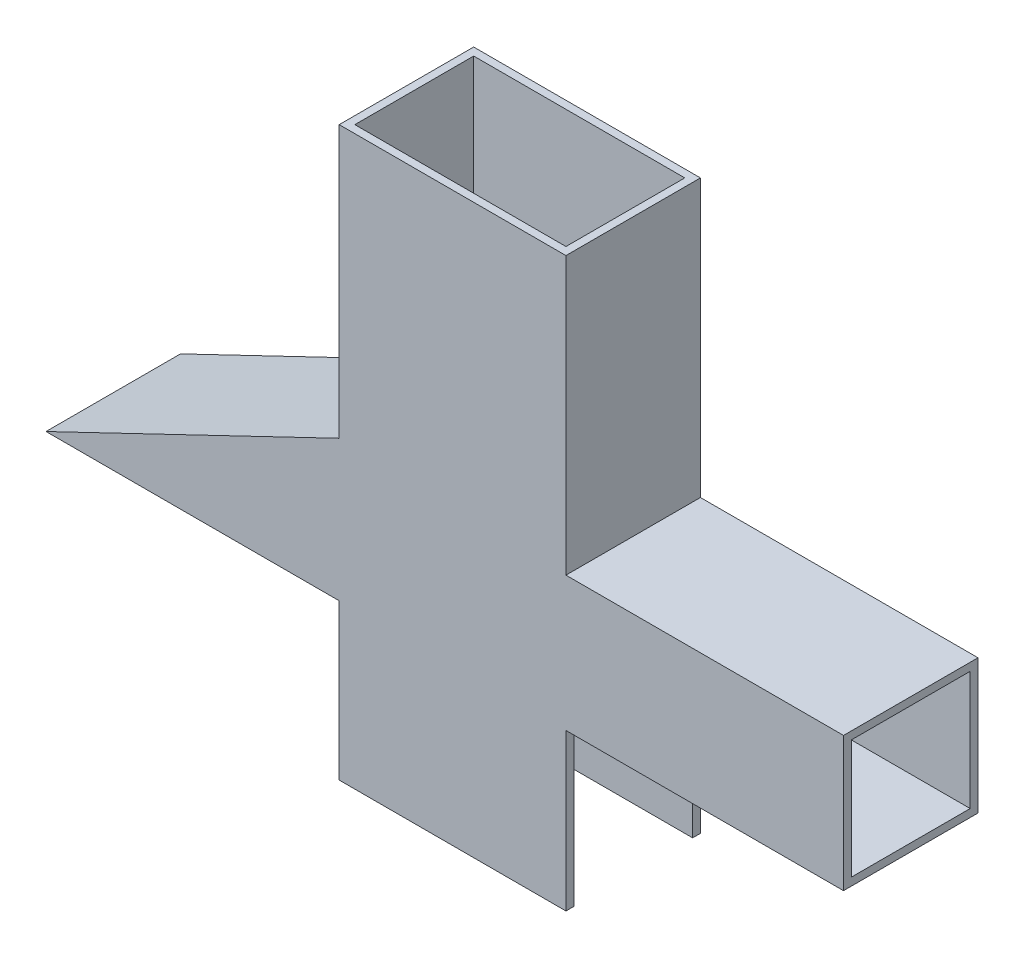
ISO-10303-21;
HEADER;
FILE_DESCRIPTION(('STEP AP214'),'2;1');
FILE_NAME('part.step','',(''),(''),'','','');
FILE_SCHEMA(('AUTOMOTIVE_DESIGN { 1 0 10303 214 1 1 1 1 }'));
ENDSEC;
DATA;
#1=APPLICATION_CONTEXT('core data for automotive mechanical design processes');
#2=APPLICATION_PROTOCOL_DEFINITION('international standard','automotive_design',2000,#1);
#3=PRODUCT_CONTEXT('',#1,'mechanical');
#4=PRODUCT('Part','Part','',(#3));
#5=PRODUCT_RELATED_PRODUCT_CATEGORY('part','',(#4));
#6=PRODUCT_DEFINITION_FORMATION('','',#4);
#7=PRODUCT_DEFINITION_CONTEXT('part definition',#1,'design');
#8=PRODUCT_DEFINITION('design','',#6,#7);
#9=PRODUCT_DEFINITION_SHAPE('','',#8);
#10=(LENGTH_UNIT() NAMED_UNIT(*) SI_UNIT(.MILLI.,.METRE.));
#11=(NAMED_UNIT(*) PLANE_ANGLE_UNIT() SI_UNIT($,.RADIAN.));
#12=(NAMED_UNIT(*) SI_UNIT($,.STERADIAN.) SOLID_ANGLE_UNIT());
#13=UNCERTAINTY_MEASURE_WITH_UNIT(LENGTH_MEASURE(1.E-05),#10,'distance_accuracy_value','');
#14=(GEOMETRIC_REPRESENTATION_CONTEXT(3) GLOBAL_UNCERTAINTY_ASSIGNED_CONTEXT((#13)) GLOBAL_UNIT_ASSIGNED_CONTEXT((#10,
#11,#12)) REPRESENTATION_CONTEXT('',''));
#15=CARTESIAN_POINT('',(0.,0.,0.));
#16=DIRECTION('',(0.,0.,1.));
#17=DIRECTION('',(1.,0.,0.));
#18=AXIS2_PLACEMENT_3D('',#15,#16,#17);
#19=CARTESIAN_POINT('',(-32.7009945375093,258.,-10.9512412704194));
#20=DIRECTION('',(1.,0.,0.));
#21=DIRECTION('',(0.,0.,-1.));
#22=AXIS2_PLACEMENT_3D('',#19,#20,#21);
#23=PLANE('',#22);
#24=DIRECTION('',(0.,0.,1.));
#25=VECTOR('',#24,1.);
#26=CARTESIAN_POINT('',(-32.7009945375092,-105.,70.0487587295806));
#27=LINE('',#26,#25);
#28=CARTESIAN_POINT('',(-32.7009945375092,-105.,-10.9512412704194));
#29=VERTEX_POINT('',#28);
#30=CARTESIAN_POINT('',(-32.7009945375092,-105.,65.0487587295806));
#31=VERTEX_POINT('',#30);
#32=EDGE_CURVE('E192',#29,#31,#27,.T.);
#33=ORIENTED_EDGE('',*,*,#32,.F.);
#34=DIRECTION('',(0.,-1.,0.));
#35=VECTOR('',#34,1.);
#36=CARTESIAN_POINT('',(-32.7009945375093,258.,-10.9512412704194));
#37=LINE('',#36,#35);
#38=CARTESIAN_POINT('',(-32.7009945375093,258.,-10.9512412704194));
#39=VERTEX_POINT('',#38);
#40=EDGE_CURVE('E51',#39,#29,#37,.T.);
#41=ORIENTED_EDGE('',*,*,#40,.F.);
#42=DIRECTION('',(0.,0.,1.));
#43=VECTOR('',#42,1.);
#44=CARTESIAN_POINT('',(-32.7009945375093,258.,-10.9512412704194));
#45=LINE('',#44,#43);
#46=CARTESIAN_POINT('',(-32.7009945375092,258.,65.0487587295806));
#47=VERTEX_POINT('',#46);
#48=EDGE_CURVE('E334',#39,#47,#45,.T.);
#49=ORIENTED_EDGE('',*,*,#48,.T.);
#50=DIRECTION('',(0.,-1.,0.));
#51=VECTOR('',#50,1.);
#52=CARTESIAN_POINT('',(-32.7009945375092,258.,65.0487587295806));
#53=LINE('',#52,#51);
#54=EDGE_CURVE('E322',#47,#31,#53,.T.);
#55=ORIENTED_EDGE('',*,*,#54,.T.);
#56=EDGE_LOOP('',(#33,#41,#49,#55));
#57=FACE_BOUND('',#56,.T.);
#58=ADVANCED_FACE('F33',(#57),#23,.T.);
#59=CARTESIAN_POINT('',(0.,-5.,0.));
#60=DIRECTION('',(0.,-1.,0.));
#61=DIRECTION('',(0.,0.,-1.));
#62=AXIS2_PLACEMENT_3D('',#59,#60,#61);
#63=PLANE('',#62);
#64=DIRECTION('',(-1.,0.,0.));
#65=VECTOR('',#64,1.);
#66=CARTESIAN_POINT('',(-32.7009945375092,-5.,-10.9512412704194));
#67=LINE('',#66,#65);
#68=CARTESIAN_POINT('',(107.299005462491,-5.,-10.9512412704194));
#69=VERTEX_POINT('',#68);
#70=CARTESIAN_POINT('',(-2.70099453750923,-5.,-10.9512412704194));
#71=VERTEX_POINT('',#70);
#72=EDGE_CURVE('E206',#69,#71,#67,.T.);
#73=ORIENTED_EDGE('',*,*,#72,.F.);
#74=DIRECTION('',(0.,0.,1.));
#75=VECTOR('',#74,1.);
#76=CARTESIAN_POINT('',(107.299005462491,-5.,-10.9512412704194));
#77=LINE('',#76,#75);
#78=CARTESIAN_POINT('',(107.299005462491,-5.,-15.9512412704194));
#79=VERTEX_POINT('',#78);
#80=EDGE_CURVE('E209',#79,#69,#77,.T.);
#81=ORIENTED_EDGE('',*,*,#80,.F.);
#82=DIRECTION('',(1.,0.,0.));
#83=VECTOR('',#82,1.);
#84=CARTESIAN_POINT('',(-37.7009945375092,-5.,-15.9512412704194));
#85=LINE('',#84,#83);
#86=CARTESIAN_POINT('',(284.799005462491,-5.,-15.9512412704194));
#87=VERTEX_POINT('',#86);
#88=EDGE_CURVE('E37',#79,#87,#85,.T.);
#89=ORIENTED_EDGE('',*,*,#88,.T.);
#90=DIRECTION('',(0.,0.,-1.));
#91=VECTOR('',#90,1.);
#92=CARTESIAN_POINT('',(284.799005462491,-5.,70.0487587295806));
#93=LINE('',#92,#91);
#94=CARTESIAN_POINT('',(284.799005462491,-5.,70.0487587295806));
#95=VERTEX_POINT('',#94);
#96=EDGE_CURVE('E249',#95,#87,#93,.T.);
#97=ORIENTED_EDGE('',*,*,#96,.F.);
#98=DIRECTION('',(-1.,0.,0.));
#99=VECTOR('',#98,1.);
#100=CARTESIAN_POINT('',(-37.7009945375092,-5.,70.0487587295806));
#101=LINE('',#100,#99);
#102=CARTESIAN_POINT('',(107.299005462491,-5.,70.0487587295806));
#103=VERTEX_POINT('',#102);
#104=EDGE_CURVE('E355',#95,#103,#101,.T.);
#105=ORIENTED_EDGE('',*,*,#104,.T.);
#106=DIRECTION('',(0.,0.,1.));
#107=VECTOR('',#106,1.);
#108=CARTESIAN_POINT('',(107.299005462491,-5.,70.0487587295806));
#109=LINE('',#108,#107);
#110=CARTESIAN_POINT('',(107.299005462491,-5.,65.0487587295806));
#111=VERTEX_POINT('',#110);
#112=EDGE_CURVE('E217',#111,#103,#109,.T.);
#113=ORIENTED_EDGE('',*,*,#112,.F.);
#114=DIRECTION('',(1.,0.,0.));
#115=VECTOR('',#114,1.);
#116=CARTESIAN_POINT('',(-32.7009945375092,-5.,65.0487587295806));
#117=LINE('',#116,#115);
#118=CARTESIAN_POINT('',(-2.70099453750924,-5.,65.0487587295806));
#119=VERTEX_POINT('',#118);
#120=EDGE_CURVE('E200',#119,#111,#117,.T.);
#121=ORIENTED_EDGE('',*,*,#120,.F.);
#122=DIRECTION('',(0.,0.,1.));
#123=VECTOR('',#122,1.);
#124=CARTESIAN_POINT('',(-2.70099453750924,-5.,65.0487587295806));
#125=LINE('',#124,#123);
#126=EDGE_CURVE('E340',#71,#119,#125,.T.);
#127=ORIENTED_EDGE('',*,*,#126,.F.);
#128=EDGE_LOOP('',(#73,#81,#89,#97,#105,#113,#121,#127));
#129=FACE_BOUND('',#128,.T.);
#130=ADVANCED_FACE('F408',(#129),#63,.T.);
#131=CARTESIAN_POINT('',(107.299005462491,258.,-15.9512412704194));
#132=DIRECTION('',(-1.,0.,0.));
#133=DIRECTION('',(0.,0.,1.));
#134=AXIS2_PLACEMENT_3D('',#131,#132,#133);
#135=PLANE('',#134);
#136=DIRECTION('',(0.,0.,1.));
#137=VECTOR('',#136,1.);
#138=CARTESIAN_POINT('',(107.299005462491,81.,70.0487587295806));
#139=LINE('',#138,#137);
#140=CARTESIAN_POINT('',(107.299005462491,81.,-15.9512412704194));
#141=VERTEX_POINT('',#140);
#142=CARTESIAN_POINT('',(107.299005462491,81.,70.0487587295806));
#143=VERTEX_POINT('',#142);
#144=EDGE_CURVE('E59',#141,#143,#139,.T.);
#145=ORIENTED_EDGE('',*,*,#144,.F.);
#146=DIRECTION('',(0.,-1.,0.));
#147=VECTOR('',#146,1.);
#148=CARTESIAN_POINT('',(107.299005462491,258.,-15.9512412704194));
#149=LINE('',#148,#147);
#150=CARTESIAN_POINT('',(107.299005462491,258.,-15.9512412704194));
#151=VERTEX_POINT('',#150);
#152=EDGE_CURVE('E264',#151,#141,#149,.T.);
#153=ORIENTED_EDGE('',*,*,#152,.F.);
#154=DIRECTION('',(0.,0.,-1.));
#155=VECTOR('',#154,1.);
#156=CARTESIAN_POINT('',(107.299005462491,258.,-15.9512412704194));
#157=LINE('',#156,#155);
#158=CARTESIAN_POINT('',(107.299005462491,258.,70.0487587295806));
#159=VERTEX_POINT('',#158);
#160=EDGE_CURVE('E315',#159,#151,#157,.T.);
#161=ORIENTED_EDGE('',*,*,#160,.F.);
#162=DIRECTION('',(0.,-1.,0.));
#163=VECTOR('',#162,1.);
#164=CARTESIAN_POINT('',(107.299005462491,258.,70.0487587295806));
#165=LINE('',#164,#163);
#166=EDGE_CURVE('E292',#159,#143,#165,.T.);
#167=ORIENTED_EDGE('',*,*,#166,.T.);
#168=EDGE_LOOP('',(#145,#153,#161,#167));
#169=FACE_BOUND('',#168,.T.);
#170=ADVANCED_FACE('F449',(#169),#135,.F.);
#171=CARTESIAN_POINT('',(-37.7009945375092,258.,-15.9512412704194));
#172=DIRECTION('',(1.,0.,0.));
#173=DIRECTION('',(0.,0.,-1.));
#174=AXIS2_PLACEMENT_3D('',#171,#172,#173);
#175=PLANE('',#174);
#176=DIRECTION('',(0.,0.,1.));
#177=VECTOR('',#176,1.);
#178=CARTESIAN_POINT('',(-37.7009945375092,-5.7005147682519,-15.9512412704194));
#179=LINE('',#178,#177);
#180=CARTESIAN_POINT('',(-37.7009945375092,-5.7005147682519,-15.9512412704194));
#181=VERTEX_POINT('',#180);
#182=CARTESIAN_POINT('',(-37.7009945375092,-5.7005147682519,70.0487587295806));
#183=VERTEX_POINT('',#182);
#184=EDGE_CURVE('E422',#181,#183,#179,.T.);
#185=ORIENTED_EDGE('',*,*,#184,.F.);
#186=DIRECTION('',(0.,-1.,0.));
#187=VECTOR('',#186,1.);
#188=CARTESIAN_POINT('',(-37.7009945375092,258.,-15.9512412704194));
#189=LINE('',#188,#187);
#190=CARTESIAN_POINT('',(-37.7009945375092,-105.,-15.9512412704194));
#191=VERTEX_POINT('',#190);
#192=EDGE_CURVE('E306',#181,#191,#189,.T.);
#193=ORIENTED_EDGE('',*,*,#192,.T.);
#194=DIRECTION('',(0.,0.,-1.));
#195=VECTOR('',#194,1.);
#196=CARTESIAN_POINT('',(-37.7009945375092,-105.,70.0487587295806));
#197=LINE('',#196,#195);
#198=CARTESIAN_POINT('',(-37.7009945375092,-105.,70.0487587295806));
#199=VERTEX_POINT('',#198);
#200=EDGE_CURVE('E189',#199,#191,#197,.T.);
#201=ORIENTED_EDGE('',*,*,#200,.F.);
#202=DIRECTION('',(0.,-1.,0.));
#203=VECTOR('',#202,1.);
#204=CARTESIAN_POINT('',(-37.7009945375092,258.,70.0487587295806));
#205=LINE('',#204,#203);
#206=EDGE_CURVE('E43',#183,#199,#205,.T.);
#207=ORIENTED_EDGE('',*,*,#206,.F.);
#208=EDGE_LOOP('',(#185,#193,#201,#207));
#209=FACE_BOUND('',#208,.T.);
#210=ADVANCED_FACE('F476',(#209),#175,.F.);
#211=CARTESIAN_POINT('',(0.,258.,0.));
#212=DIRECTION('',(0.,1.,0.));
#213=DIRECTION('',(0.,0.,1.));
#214=AXIS2_PLACEMENT_3D('',#211,#212,#213);
#215=PLANE('',#214);
#216=DIRECTION('',(0.,0.,1.));
#217=VECTOR('',#216,1.);
#218=CARTESIAN_POINT('',(-37.7009945375092,258.,-15.9512412704194));
#219=LINE('',#218,#217);
#220=CARTESIAN_POINT('',(-37.7009945375092,258.,-15.9512412704194));
#221=VERTEX_POINT('',#220);
#222=CARTESIAN_POINT('',(-37.7009945375092,258.,70.0487587295806));
#223=VERTEX_POINT('',#222);
#224=EDGE_CURVE('E319',#221,#223,#219,.T.);
#225=ORIENTED_EDGE('',*,*,#224,.T.);
#226=DIRECTION('',(1.,0.,0.));
#227=VECTOR('',#226,1.);
#228=CARTESIAN_POINT('',(-37.7009945375092,258.,70.0487587295806));
#229=LINE('',#228,#227);
#230=EDGE_CURVE('E317',#223,#159,#229,.T.);
#231=ORIENTED_EDGE('',*,*,#230,.T.);
#232=ORIENTED_EDGE('',*,*,#160,.T.);
#233=DIRECTION('',(-1.,0.,0.));
#234=VECTOR('',#233,1.);
#235=CARTESIAN_POINT('',(-37.7009945375092,258.,-15.9512412704194));
#236=LINE('',#235,#234);
#237=EDGE_CURVE('E309',#151,#221,#236,.T.);
#238=ORIENTED_EDGE('',*,*,#237,.T.);
#239=EDGE_LOOP('',(#225,#231,#232,#238));
#240=FACE_BOUND('',#239,.T.);
#241=DIRECTION('',(1.,0.,0.));
#242=VECTOR('',#241,1.);
#243=CARTESIAN_POINT('',(-32.7009945375092,258.,65.0487587295806));
#244=LINE('',#243,#242);
#245=CARTESIAN_POINT('',(102.299005462491,258.,65.0487587295806));
#246=VERTEX_POINT('',#245);
#247=EDGE_CURVE('E370',#47,#246,#244,.T.);
#248=ORIENTED_EDGE('',*,*,#247,.F.);
#249=ORIENTED_EDGE('',*,*,#48,.F.);
#250=DIRECTION('',(-1.,0.,0.));
#251=VECTOR('',#250,1.);
#252=CARTESIAN_POINT('',(-32.7009945375093,258.,-10.9512412704194));
#253=LINE('',#252,#251);
#254=CARTESIAN_POINT('',(102.299005462491,258.,-10.9512412704194));
#255=VERTEX_POINT('',#254);
#256=EDGE_CURVE('E365',#255,#39,#253,.T.);
#257=ORIENTED_EDGE('',*,*,#256,.F.);
#258=DIRECTION('',(0.,0.,-1.));
#259=VECTOR('',#258,1.);
#260=CARTESIAN_POINT('',(102.299005462491,258.,-10.9512412704194));
#261=LINE('',#260,#259);
#262=EDGE_CURVE('E367',#246,#255,#261,.T.);
#263=ORIENTED_EDGE('',*,*,#262,.F.);
#264=EDGE_LOOP('',(#248,#249,#257,#263));
#265=FACE_BOUND('',#264,.T.);
#266=ADVANCED_FACE('F384',(#240,#265),#215,.T.);
#267=CARTESIAN_POINT('',(-37.7009945375093,84.2994852317481,-15.9512412704194));
#268=VERTEX_POINT('',#267);
#269=EDGE_CURVE('E308',#221,#268,#189,.T.);
#270=ORIENTED_EDGE('',*,*,#269,.T.);
#271=DIRECTION('',(0.,0.,1.));
#272=VECTOR('',#271,1.);
#273=CARTESIAN_POINT('',(-37.7009945375093,84.2994852317481,-15.9512412704194));
#274=LINE('',#273,#272);
#275=CARTESIAN_POINT('',(-37.7009945375092,84.2994852317481,70.0487587295806));
#276=VERTEX_POINT('',#275);
#277=EDGE_CURVE('E424',#268,#276,#274,.T.);
#278=ORIENTED_EDGE('',*,*,#277,.T.);
#279=EDGE_CURVE('E11',#223,#276,#205,.T.);
#280=ORIENTED_EDGE('',*,*,#279,.F.);
#281=ORIENTED_EDGE('',*,*,#224,.F.);
#282=EDGE_LOOP('',(#270,#278,#280,#281));
#283=FACE_BOUND('',#282,.T.);
#284=ADVANCED_FACE('F35',(#283),#175,.F.);
#285=CARTESIAN_POINT('',(-37.7009945375092,258.,70.0487587295806));
#286=DIRECTION('',(0.,0.,-1.));
#287=DIRECTION('',(-1.,0.,0.));
#288=AXIS2_PLACEMENT_3D('',#285,#286,#287);
#289=PLANE('',#288);
#290=ORIENTED_EDGE('',*,*,#279,.T.);
#291=DIRECTION('',(-0.901523057468274,-0.432731067584771,0.));
#292=VECTOR('',#291,1.);
#293=CARTESIAN_POINT('',(-37.7009945375093,84.2994852317481,70.0487587295806));
#294=LINE('',#293,#292);
#295=CARTESIAN_POINT('',(-225.200994537509,-5.7005147682519,70.0487587295806));
#296=VERTEX_POINT('',#295);
#297=EDGE_CURVE('E279',#276,#296,#294,.T.);
#298=ORIENTED_EDGE('',*,*,#297,.T.);
#299=DIRECTION('',(1.,0.,0.));
#300=VECTOR('',#299,1.);
#301=CARTESIAN_POINT('',(-225.200994537509,-5.7005147682519,70.0487587295806));
#302=LINE('',#301,#300);
#303=EDGE_CURVE('E273',#296,#183,#302,.T.);
#304=ORIENTED_EDGE('',*,*,#303,.T.);
#305=ORIENTED_EDGE('',*,*,#206,.T.);
#306=DIRECTION('',(-1.,0.,0.));
#307=VECTOR('',#306,1.);
#308=CARTESIAN_POINT('',(-37.7009945375092,-105.,70.0487587295806));
#309=LINE('',#308,#307);
#310=CARTESIAN_POINT('',(107.299005462491,-105.,70.0487587295806));
#311=VERTEX_POINT('',#310);
#312=EDGE_CURVE('E346',#311,#199,#309,.T.);
#313=ORIENTED_EDGE('',*,*,#312,.F.);
#314=DIRECTION('',(0.,1.,0.));
#315=VECTOR('',#314,1.);
#316=CARTESIAN_POINT('',(107.299005462491,-105.,70.0487587295806));
#317=LINE('',#316,#315);
#318=EDGE_CURVE('E220',#311,#103,#317,.T.);
#319=ORIENTED_EDGE('',*,*,#318,.T.);
#320=ORIENTED_EDGE('',*,*,#104,.F.);
#321=DIRECTION('',(0.,-1.,0.));
#322=VECTOR('',#321,1.);
#323=CARTESIAN_POINT('',(284.799005462491,81.,70.0487587295806));
#324=LINE('',#323,#322);
#325=CARTESIAN_POINT('',(284.799005462491,81.,70.0487587295806));
#326=VERTEX_POINT('',#325);
#327=EDGE_CURVE('E246',#326,#95,#324,.T.);
#328=ORIENTED_EDGE('',*,*,#327,.F.);
#329=DIRECTION('',(-1.,0.,0.));
#330=VECTOR('',#329,1.);
#331=CARTESIAN_POINT('',(284.799005462491,81.,70.0487587295806));
#332=LINE('',#331,#330);
#333=EDGE_CURVE('E256',#326,#143,#332,.T.);
#334=ORIENTED_EDGE('',*,*,#333,.T.);
#335=ORIENTED_EDGE('',*,*,#166,.F.);
#336=ORIENTED_EDGE('',*,*,#230,.F.);
#337=EDGE_LOOP('',(#290,#298,#304,#305,#313,#319,#320,#328,#334,#335,#336));
#338=FACE_BOUND('',#337,.T.);
#339=ADVANCED_FACE('F415',(#338),#289,.F.);
#340=CARTESIAN_POINT('',(-37.7009945375092,258.,-15.9512412704194));
#341=DIRECTION('',(0.,0.,1.));
#342=DIRECTION('',(1.,0.,0.));
#343=AXIS2_PLACEMENT_3D('',#340,#341,#342);
#344=PLANE('',#343);
#345=ORIENTED_EDGE('',*,*,#152,.T.);
#346=DIRECTION('',(-1.,0.,0.));
#347=VECTOR('',#346,1.);
#348=CARTESIAN_POINT('',(284.799005462491,81.,-15.9512412704194));
#349=LINE('',#348,#347);
#350=CARTESIAN_POINT('',(284.799005462491,81.,-15.9512412704194));
#351=VERTEX_POINT('',#350);
#352=EDGE_CURVE('E269',#351,#141,#349,.T.);
#353=ORIENTED_EDGE('',*,*,#352,.F.);
#354=DIRECTION('',(0.,1.,0.));
#355=VECTOR('',#354,1.);
#356=CARTESIAN_POINT('',(284.799005462491,81.,-15.9512412704194));
#357=LINE('',#356,#355);
#358=EDGE_CURVE('E252',#87,#351,#357,.T.);
#359=ORIENTED_EDGE('',*,*,#358,.F.);
#360=ORIENTED_EDGE('',*,*,#88,.F.);
#361=DIRECTION('',(0.,1.,0.));
#362=VECTOR('',#361,1.);
#363=CARTESIAN_POINT('',(107.299005462491,-105.,-15.9512412704194));
#364=LINE('',#363,#362);
#365=CARTESIAN_POINT('',(107.299005462491,-105.,-15.9512412704194));
#366=VERTEX_POINT('',#365);
#367=EDGE_CURVE('E195',#366,#79,#364,.T.);
#368=ORIENTED_EDGE('',*,*,#367,.F.);
#369=DIRECTION('',(1.,0.,0.));
#370=VECTOR('',#369,1.);
#371=CARTESIAN_POINT('',(-37.7009945375092,-105.,-15.9512412704194));
#372=LINE('',#371,#370);
#373=EDGE_CURVE('E181',#191,#366,#372,.T.);
#374=ORIENTED_EDGE('',*,*,#373,.F.);
#375=ORIENTED_EDGE('',*,*,#192,.F.);
#376=DIRECTION('',(1.,0.,0.));
#377=VECTOR('',#376,1.);
#378=CARTESIAN_POINT('',(-225.200994537509,-5.7005147682519,-15.9512412704194));
#379=LINE('',#378,#377);
#380=CARTESIAN_POINT('',(-225.200994537509,-5.7005147682519,-15.9512412704194));
#381=VERTEX_POINT('',#380);
#382=EDGE_CURVE('E285',#381,#181,#379,.T.);
#383=ORIENTED_EDGE('',*,*,#382,.F.);
#384=DIRECTION('',(-0.901523057468274,-0.432731067584771,0.));
#385=VECTOR('',#384,1.);
#386=CARTESIAN_POINT('',(-37.7009945375093,84.2994852317481,-15.9512412704194));
#387=LINE('',#386,#385);
#388=EDGE_CURVE('E425',#268,#381,#387,.T.);
#389=ORIENTED_EDGE('',*,*,#388,.F.);
#390=ORIENTED_EDGE('',*,*,#269,.F.);
#391=ORIENTED_EDGE('',*,*,#237,.F.);
#392=EDGE_LOOP('',(#345,#353,#359,#360,#368,#374,#375,#383,#389,#390,#391));
#393=FACE_BOUND('',#392,.T.);
#394=ADVANCED_FACE('F196',(#393),#344,.F.);
#395=CARTESIAN_POINT('',(-32.7009945375092,258.,65.0487587295806));
#396=DIRECTION('',(0.,0.,-1.));
#397=DIRECTION('',(-1.,0.,0.));
#398=AXIS2_PLACEMENT_3D('',#395,#396,#397);
#399=PLANE('',#398);
#400=DIRECTION('',(0.,-1.,0.));
#401=VECTOR('',#400,1.);
#402=CARTESIAN_POINT('',(102.299005462491,258.,65.0487587295806));
#403=LINE('',#402,#401);
#404=CARTESIAN_POINT('',(102.299005462491,76.,65.0487587295806));
#405=VERTEX_POINT('',#404);
#406=EDGE_CURVE('E323',#246,#405,#403,.T.);
#407=ORIENTED_EDGE('',*,*,#406,.T.);
#408=DIRECTION('',(-1.,0.,0.));
#409=VECTOR('',#408,1.);
#410=CARTESIAN_POINT('',(284.799005462491,76.,65.0487587295806));
#411=LINE('',#410,#409);
#412=CARTESIAN_POINT('',(284.799005462491,76.,65.0487587295806));
#413=VERTEX_POINT('',#412);
#414=EDGE_CURVE('E242',#413,#405,#411,.T.);
#415=ORIENTED_EDGE('',*,*,#414,.F.);
#416=DIRECTION('',(0.,-1.,0.));
#417=VECTOR('',#416,1.);
#418=CARTESIAN_POINT('',(284.799005462491,76.,65.0487587295806));
#419=LINE('',#418,#417);
#420=CARTESIAN_POINT('',(284.799005462491,0.,65.0487587295806));
#421=VERTEX_POINT('',#420);
#422=EDGE_CURVE('E231',#413,#421,#419,.T.);
#423=ORIENTED_EDGE('',*,*,#422,.T.);
#424=DIRECTION('',(1.,0.,0.));
#425=VECTOR('',#424,1.);
#426=CARTESIAN_POINT('',(-32.7009945375092,0.,65.0487587295806));
#427=LINE('',#426,#425);
#428=CARTESIAN_POINT('',(-2.70099453750924,0.,65.0487587295806));
#429=VERTEX_POINT('',#428);
#430=EDGE_CURVE('E300',#429,#421,#427,.T.);
#431=ORIENTED_EDGE('',*,*,#430,.F.);
#432=DIRECTION('',(0.,-1.,0.));
#433=VECTOR('',#432,1.);
#434=CARTESIAN_POINT('',(-2.70099453750924,0.,65.0487587295806));
#435=LINE('',#434,#433);
#436=EDGE_CURVE('E341',#429,#119,#435,.T.);
#437=ORIENTED_EDGE('',*,*,#436,.T.);
#438=ORIENTED_EDGE('',*,*,#120,.T.);
#439=DIRECTION('',(0.,1.,0.));
#440=VECTOR('',#439,1.);
#441=CARTESIAN_POINT('',(107.299005462491,-105.,65.0487587295806));
#442=LINE('',#441,#440);
#443=CARTESIAN_POINT('',(107.299005462491,-105.,65.0487587295806));
#444=VERTEX_POINT('',#443);
#445=EDGE_CURVE('E225',#444,#111,#442,.T.);
#446=ORIENTED_EDGE('',*,*,#445,.F.);
#447=DIRECTION('',(1.,0.,0.));
#448=VECTOR('',#447,1.);
#449=CARTESIAN_POINT('',(-32.7009945375092,-105.,65.0487587295806));
#450=LINE('',#449,#448);
#451=EDGE_CURVE('E214',#31,#444,#450,.T.);
#452=ORIENTED_EDGE('',*,*,#451,.F.);
#453=ORIENTED_EDGE('',*,*,#54,.F.);
#454=ORIENTED_EDGE('',*,*,#247,.T.);
#455=EDGE_LOOP('',(#407,#415,#423,#431,#437,#438,#446,#452,#453,#454));
#456=FACE_BOUND('',#455,.T.);
#457=ADVANCED_FACE('F381',(#456),#399,.T.);
#458=CARTESIAN_POINT('',(102.299005462491,258.,-10.9512412704194));
#459=DIRECTION('',(-1.,0.,0.));
#460=DIRECTION('',(0.,0.,1.));
#461=AXIS2_PLACEMENT_3D('',#458,#459,#460);
#462=PLANE('',#461);
#463=DIRECTION('',(0.,0.,-1.));
#464=VECTOR('',#463,1.);
#465=CARTESIAN_POINT('',(102.299005462491,76.,-10.9512412704194));
#466=LINE('',#465,#464);
#467=CARTESIAN_POINT('',(102.299005462491,76.,-10.9512412704193));
#468=VERTEX_POINT('',#467);
#469=EDGE_CURVE('E228',#405,#468,#466,.T.);
#470=ORIENTED_EDGE('',*,*,#469,.F.);
#471=ORIENTED_EDGE('',*,*,#406,.F.);
#472=ORIENTED_EDGE('',*,*,#262,.T.);
#473=DIRECTION('',(0.,-1.,0.));
#474=VECTOR('',#473,1.);
#475=CARTESIAN_POINT('',(102.299005462491,258.,-10.9512412704194));
#476=LINE('',#475,#474);
#477=EDGE_CURVE('E326',#255,#468,#476,.T.);
#478=ORIENTED_EDGE('',*,*,#477,.T.);
#479=EDGE_LOOP('',(#470,#471,#472,#478));
#480=FACE_BOUND('',#479,.T.);
#481=ADVANCED_FACE('F387',(#480),#462,.T.);
#482=CARTESIAN_POINT('',(-32.7009945375093,258.,-10.9512412704194));
#483=DIRECTION('',(0.,0.,1.));
#484=DIRECTION('',(1.,0.,0.));
#485=AXIS2_PLACEMENT_3D('',#482,#483,#484);
#486=PLANE('',#485);
#487=DIRECTION('',(-1.,0.,0.));
#488=VECTOR('',#487,1.);
#489=CARTESIAN_POINT('',(-32.7009945375093,0.,-10.9512412704194));
#490=LINE('',#489,#488);
#491=CARTESIAN_POINT('',(284.799005462491,0.,-10.9512412704194));
#492=VERTEX_POINT('',#491);
#493=CARTESIAN_POINT('',(-2.70099453750923,0.,-10.9512412704194));
#494=VERTEX_POINT('',#493);
#495=EDGE_CURVE('E332',#492,#494,#490,.T.);
#496=ORIENTED_EDGE('',*,*,#495,.F.);
#497=DIRECTION('',(0.,1.,0.));
#498=VECTOR('',#497,1.);
#499=CARTESIAN_POINT('',(284.799005462491,76.,-10.9512412704194));
#500=LINE('',#499,#498);
#501=CARTESIAN_POINT('',(284.799005462491,76.,-10.9512412704194));
#502=VERTEX_POINT('',#501);
#503=EDGE_CURVE('E237',#492,#502,#500,.T.);
#504=ORIENTED_EDGE('',*,*,#503,.T.);
#505=DIRECTION('',(-1.,0.,0.));
#506=VECTOR('',#505,1.);
#507=CARTESIAN_POINT('',(284.799005462491,76.,-10.9512412704194));
#508=LINE('',#507,#506);
#509=EDGE_CURVE('E244',#502,#468,#508,.T.);
#510=ORIENTED_EDGE('',*,*,#509,.T.);
#511=ORIENTED_EDGE('',*,*,#477,.F.);
#512=ORIENTED_EDGE('',*,*,#256,.T.);
#513=ORIENTED_EDGE('',*,*,#40,.T.);
#514=DIRECTION('',(-1.,0.,0.));
#515=VECTOR('',#514,1.);
#516=CARTESIAN_POINT('',(-32.7009945375092,-105.,-10.9512412704194));
#517=LINE('',#516,#515);
#518=CARTESIAN_POINT('',(107.299005462491,-105.,-10.9512412704194));
#519=VERTEX_POINT('',#518);
#520=EDGE_CURVE('E205',#519,#29,#517,.T.);
#521=ORIENTED_EDGE('',*,*,#520,.F.);
#522=DIRECTION('',(0.,1.,0.));
#523=VECTOR('',#522,1.);
#524=CARTESIAN_POINT('',(107.299005462491,-105.,-10.9512412704194));
#525=LINE('',#524,#523);
#526=EDGE_CURVE('E201',#519,#69,#525,.T.);
#527=ORIENTED_EDGE('',*,*,#526,.T.);
#528=ORIENTED_EDGE('',*,*,#72,.T.);
#529=DIRECTION('',(0.,-1.,0.));
#530=VECTOR('',#529,1.);
#531=CARTESIAN_POINT('',(-2.70099453750923,0.,-10.9512412704194));
#532=LINE('',#531,#530);
#533=EDGE_CURVE('E339',#494,#71,#532,.T.);
#534=ORIENTED_EDGE('',*,*,#533,.F.);
#535=EDGE_LOOP('',(#496,#504,#510,#511,#512,#513,#521,#527,#528,#534));
#536=FACE_BOUND('',#535,.T.);
#537=ADVANCED_FACE('F453',(#536),#486,.T.);
#538=CARTESIAN_POINT('',(0.,0.,0.));
#539=DIRECTION('',(0.,-1.,0.));
#540=DIRECTION('',(0.,0.,-1.));
#541=AXIS2_PLACEMENT_3D('',#538,#539,#540);
#542=PLANE('',#541);
#543=ORIENTED_EDGE('',*,*,#495,.T.);
#544=DIRECTION('',(0.,0.,1.));
#545=VECTOR('',#544,1.);
#546=CARTESIAN_POINT('',(-2.70099453750924,0.,65.0487587295806));
#547=LINE('',#546,#545);
#548=EDGE_CURVE('E335',#494,#429,#547,.T.);
#549=ORIENTED_EDGE('',*,*,#548,.T.);
#550=ORIENTED_EDGE('',*,*,#430,.T.);
#551=DIRECTION('',(0.,0.,-1.));
#552=VECTOR('',#551,1.);
#553=CARTESIAN_POINT('',(284.799005462491,0.,65.0487587295806));
#554=LINE('',#553,#552);
#555=EDGE_CURVE('E234',#421,#492,#554,.T.);
#556=ORIENTED_EDGE('',*,*,#555,.T.);
#557=EDGE_LOOP('',(#543,#549,#550,#556));
#558=FACE_BOUND('',#557,.T.);
#559=ADVANCED_FACE('F398',(#558),#542,.F.);
#560=CARTESIAN_POINT('',(-2.70099453750924,0.,65.0487587295806));
#561=DIRECTION('',(1.,0.,0.));
#562=DIRECTION('',(0.,0.,-1.));
#563=AXIS2_PLACEMENT_3D('',#560,#561,#562);
#564=PLANE('',#563);
#565=ORIENTED_EDGE('',*,*,#126,.T.);
#566=ORIENTED_EDGE('',*,*,#436,.F.);
#567=ORIENTED_EDGE('',*,*,#548,.F.);
#568=ORIENTED_EDGE('',*,*,#533,.T.);
#569=EDGE_LOOP('',(#565,#566,#567,#568));
#570=FACE_BOUND('',#569,.T.);
#571=ADVANCED_FACE('F405',(#570),#564,.F.);
#572=CARTESIAN_POINT('',(0.,-105.,0.));
#573=DIRECTION('',(0.,-1.,0.));
#574=DIRECTION('',(0.,0.,-1.));
#575=AXIS2_PLACEMENT_3D('',#572,#573,#574);
#576=PLANE('',#575);
#577=ORIENTED_EDGE('',*,*,#200,.T.);
#578=ORIENTED_EDGE('',*,*,#373,.T.);
#579=DIRECTION('',(0.,0.,1.));
#580=VECTOR('',#579,1.);
#581=CARTESIAN_POINT('',(107.299005462491,-105.,-10.9512412704194));
#582=LINE('',#581,#580);
#583=EDGE_CURVE('E185',#366,#519,#582,.T.);
#584=ORIENTED_EDGE('',*,*,#583,.T.);
#585=ORIENTED_EDGE('',*,*,#520,.T.);
#586=ORIENTED_EDGE('',*,*,#32,.T.);
#587=ORIENTED_EDGE('',*,*,#451,.T.);
#588=DIRECTION('',(0.,0.,1.));
#589=VECTOR('',#588,1.);
#590=CARTESIAN_POINT('',(107.299005462491,-105.,70.0487587295806));
#591=LINE('',#590,#589);
#592=EDGE_CURVE('E216',#444,#311,#591,.T.);
#593=ORIENTED_EDGE('',*,*,#592,.T.);
#594=ORIENTED_EDGE('',*,*,#312,.T.);
#595=EDGE_LOOP('',(#577,#578,#584,#585,#586,#587,#593,#594));
#596=FACE_BOUND('',#595,.T.);
#597=ADVANCED_FACE('F183',(#596),#576,.T.);
#598=CARTESIAN_POINT('',(-225.200994537509,-5.7005147682519,-15.9512412704194));
#599=DIRECTION('',(0.,-1.,0.));
#600=DIRECTION('',(0.,0.,-1.));
#601=AXIS2_PLACEMENT_3D('',#598,#599,#600);
#602=PLANE('',#601);
#603=ORIENTED_EDGE('',*,*,#303,.F.);
#604=DIRECTION('',(0.,0.,1.));
#605=VECTOR('',#604,1.);
#606=CARTESIAN_POINT('',(-225.200994537509,-5.7005147682519,-15.9512412704194));
#607=LINE('',#606,#605);
#608=EDGE_CURVE('E259',#381,#296,#607,.T.);
#609=ORIENTED_EDGE('',*,*,#608,.F.);
#610=ORIENTED_EDGE('',*,*,#382,.T.);
#611=ORIENTED_EDGE('',*,*,#184,.T.);
#612=EDGE_LOOP('',(#603,#609,#610,#611));
#613=FACE_BOUND('',#612,.T.);
#614=ADVANCED_FACE('F442',(#613),#602,.T.);
#615=CARTESIAN_POINT('',(-37.7009945375093,84.2994852317481,-15.9512412704194));
#616=DIRECTION('',(-0.432731067584771,0.901523057468274,0.));
#617=DIRECTION('',(-0.901523057468274,-0.432731067584771,0.));
#618=AXIS2_PLACEMENT_3D('',#615,#616,#617);
#619=PLANE('',#618);
#620=ORIENTED_EDGE('',*,*,#297,.F.);
#621=ORIENTED_EDGE('',*,*,#277,.F.);
#622=ORIENTED_EDGE('',*,*,#388,.T.);
#623=ORIENTED_EDGE('',*,*,#608,.T.);
#624=EDGE_LOOP('',(#620,#621,#622,#623));
#625=FACE_BOUND('',#624,.T.);
#626=ADVANCED_FACE('F441',(#625),#619,.T.);
#627=CARTESIAN_POINT('',(284.799005462491,0.,0.));
#628=DIRECTION('',(1.,0.,0.));
#629=DIRECTION('',(0.,0.,-1.));
#630=AXIS2_PLACEMENT_3D('',#627,#628,#629);
#631=PLANE('',#630);
#632=ORIENTED_EDGE('',*,*,#327,.T.);
#633=ORIENTED_EDGE('',*,*,#96,.T.);
#634=ORIENTED_EDGE('',*,*,#358,.T.);
#635=DIRECTION('',(0.,0.,1.));
#636=VECTOR('',#635,1.);
#637=CARTESIAN_POINT('',(284.799005462491,81.,70.0487587295806));
#638=LINE('',#637,#636);
#639=EDGE_CURVE('E254',#351,#326,#638,.T.);
#640=ORIENTED_EDGE('',*,*,#639,.T.);
#641=EDGE_LOOP('',(#632,#633,#634,#640));
#642=FACE_BOUND('',#641,.T.);
#643=ORIENTED_EDGE('',*,*,#555,.F.);
#644=ORIENTED_EDGE('',*,*,#422,.F.);
#645=DIRECTION('',(0.,0.,1.));
#646=VECTOR('',#645,1.);
#647=CARTESIAN_POINT('',(284.799005462491,76.,65.0487587295806));
#648=LINE('',#647,#646);
#649=EDGE_CURVE('E240',#502,#413,#648,.T.);
#650=ORIENTED_EDGE('',*,*,#649,.F.);
#651=ORIENTED_EDGE('',*,*,#503,.F.);
#652=EDGE_LOOP('',(#643,#644,#650,#651));
#653=FACE_BOUND('',#652,.T.);
#654=ADVANCED_FACE('F395',(#642,#653),#631,.T.);
#655=CARTESIAN_POINT('',(284.799005462491,81.,70.0487587295806));
#656=DIRECTION('',(0.,-1.,0.));
#657=DIRECTION('',(0.,0.,-1.));
#658=AXIS2_PLACEMENT_3D('',#655,#656,#657);
#659=PLANE('',#658);
#660=ORIENTED_EDGE('',*,*,#144,.T.);
#661=ORIENTED_EDGE('',*,*,#333,.F.);
#662=ORIENTED_EDGE('',*,*,#639,.F.);
#663=ORIENTED_EDGE('',*,*,#352,.T.);
#664=EDGE_LOOP('',(#660,#661,#662,#663));
#665=FACE_BOUND('',#664,.T.);
#666=ADVANCED_FACE('F451',(#665),#659,.F.);
#667=CARTESIAN_POINT('',(284.799005462491,76.,65.0487587295806));
#668=DIRECTION('',(0.,-1.,0.));
#669=DIRECTION('',(0.,0.,-1.));
#670=AXIS2_PLACEMENT_3D('',#667,#668,#669);
#671=PLANE('',#670);
#672=ORIENTED_EDGE('',*,*,#414,.T.);
#673=ORIENTED_EDGE('',*,*,#469,.T.);
#674=ORIENTED_EDGE('',*,*,#509,.F.);
#675=ORIENTED_EDGE('',*,*,#649,.T.);
#676=EDGE_LOOP('',(#672,#673,#674,#675));
#677=FACE_BOUND('',#676,.T.);
#678=ADVANCED_FACE('F455',(#677),#671,.T.);
#679=CARTESIAN_POINT('',(107.299005462491,-105.,70.0487587295806));
#680=DIRECTION('',(-1.,0.,0.));
#681=DIRECTION('',(0.,0.,1.));
#682=AXIS2_PLACEMENT_3D('',#679,#680,#681);
#683=PLANE('',#682);
#684=ORIENTED_EDGE('',*,*,#112,.T.);
#685=ORIENTED_EDGE('',*,*,#318,.F.);
#686=ORIENTED_EDGE('',*,*,#592,.F.);
#687=ORIENTED_EDGE('',*,*,#445,.T.);
#688=EDGE_LOOP('',(#684,#685,#686,#687));
#689=FACE_BOUND('',#688,.T.);
#690=ADVANCED_FACE('F413',(#689),#683,.F.);
#691=CARTESIAN_POINT('',(107.299005462491,-105.,-10.9512412704194));
#692=DIRECTION('',(-1.,0.,0.));
#693=DIRECTION('',(0.,0.,1.));
#694=AXIS2_PLACEMENT_3D('',#691,#692,#693);
#695=PLANE('',#694);
#696=ORIENTED_EDGE('',*,*,#80,.T.);
#697=ORIENTED_EDGE('',*,*,#526,.F.);
#698=ORIENTED_EDGE('',*,*,#583,.F.);
#699=ORIENTED_EDGE('',*,*,#367,.T.);
#700=EDGE_LOOP('',(#696,#697,#698,#699));
#701=FACE_BOUND('',#700,.T.);
#702=ADVANCED_FACE('F203',(#701),#695,.F.);
#703=CLOSED_SHELL('',(#58,#130,#170,#210,#266,#284,#339,#394,#457,#481,#537,#559,#571,#597,#614,
#626,#654,#666,#678,#690,#702));
#704=MANIFOLD_SOLID_BREP('B2',#703);
#705=ADVANCED_BREP_SHAPE_REPRESENTATION('',(#18,#704),#14);
#706=SHAPE_DEFINITION_REPRESENTATION(#9,#705);
ENDSEC;
END-ISO-10303-21;
